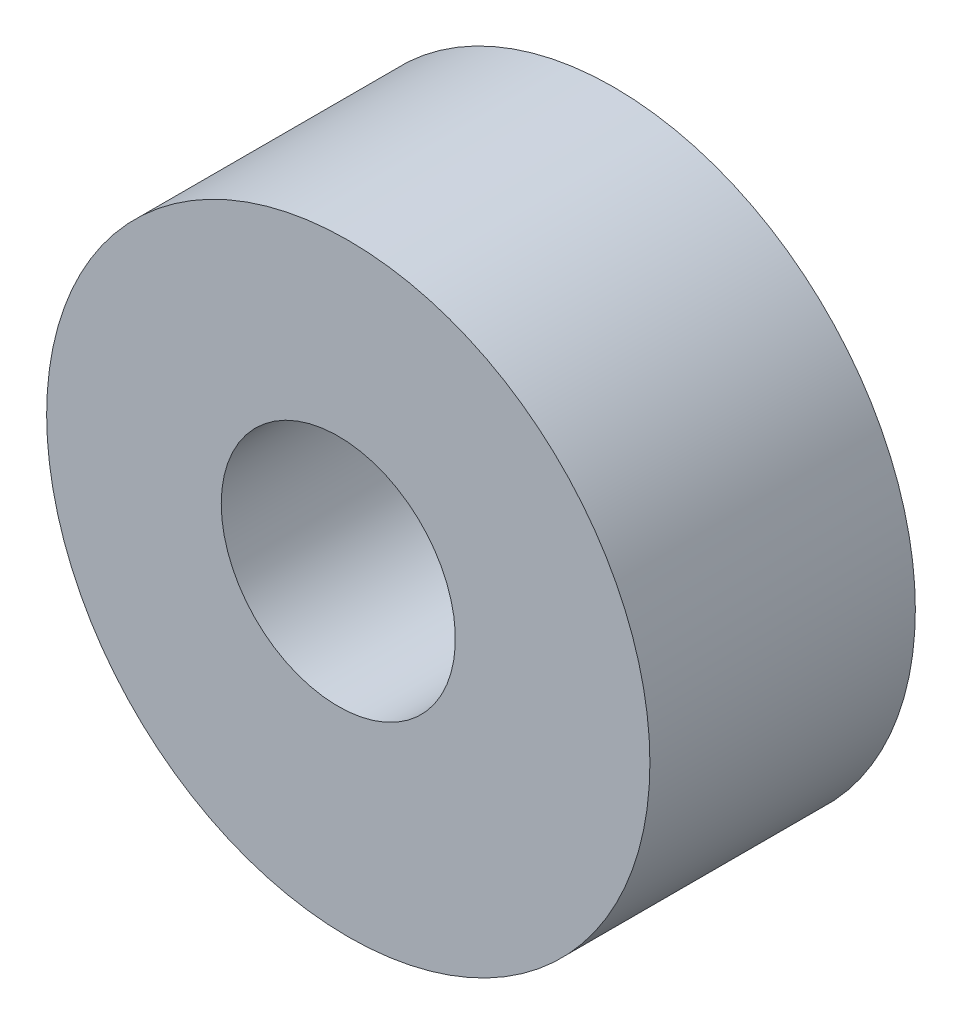
ISO-10303-21;
HEADER;
FILE_DESCRIPTION(('STEP AP214'),'2;1');
FILE_NAME('part.step','',(''),(''),'','','');
FILE_SCHEMA(('AUTOMOTIVE_DESIGN { 1 0 10303 214 1 1 1 1 }'));
ENDSEC;
DATA;
#1=APPLICATION_CONTEXT('core data for automotive mechanical design processes');
#2=APPLICATION_PROTOCOL_DEFINITION('international standard','automotive_design',2000,#1);
#3=PRODUCT_CONTEXT('',#1,'mechanical');
#4=PRODUCT('Part','Part','',(#3));
#5=PRODUCT_RELATED_PRODUCT_CATEGORY('part','',(#4));
#6=PRODUCT_DEFINITION_FORMATION('','',#4);
#7=PRODUCT_DEFINITION_CONTEXT('part definition',#1,'design');
#8=PRODUCT_DEFINITION('design','',#6,#7);
#9=PRODUCT_DEFINITION_SHAPE('','',#8);
#10=(LENGTH_UNIT() NAMED_UNIT(*) SI_UNIT(.MILLI.,.METRE.));
#11=(NAMED_UNIT(*) PLANE_ANGLE_UNIT() SI_UNIT($,.RADIAN.));
#12=(NAMED_UNIT(*) SI_UNIT($,.STERADIAN.) SOLID_ANGLE_UNIT());
#13=UNCERTAINTY_MEASURE_WITH_UNIT(LENGTH_MEASURE(1.E-05),#10,'distance_accuracy_value','');
#14=(GEOMETRIC_REPRESENTATION_CONTEXT(3) GLOBAL_UNCERTAINTY_ASSIGNED_CONTEXT((#13)) GLOBAL_UNIT_ASSIGNED_CONTEXT((#10,
#11,#12)) REPRESENTATION_CONTEXT('',''));
#15=CARTESIAN_POINT('',(0.,0.,0.));
#16=DIRECTION('',(0.,0.,1.));
#17=DIRECTION('',(1.,0.,0.));
#18=AXIS2_PLACEMENT_3D('',#15,#16,#17);
#19=CARTESIAN_POINT('',(0.,0.,5.588));
#20=DIRECTION('',(0.,0.,1.));
#21=DIRECTION('',(1.,0.,0.));
#22=AXIS2_PLACEMENT_3D('',#19,#20,#21);
#23=PLANE('',#22);
#24=CARTESIAN_POINT('',(0.,0.,5.588));
#25=DIRECTION('',(0.,0.,1.));
#26=DIRECTION('',(1.,0.,0.));
#27=AXIS2_PLACEMENT_3D('',#24,#25,#26);
#28=CIRCLE('',#27,6.35);
#29=CARTESIAN_POINT('',(6.35,0.,5.588));
#30=VERTEX_POINT('',#29);
#31=EDGE_CURVE('E10',#30,#30,#28,.T.);
#32=ORIENTED_EDGE('',*,*,#31,.T.);
#33=EDGE_LOOP('',(#32));
#34=FACE_BOUND('',#33,.T.);
#35=CARTESIAN_POINT('',(-0.210184999997926,0.210789276342698,5.588));
#36=DIRECTION('',(0.,0.,1.));
#37=DIRECTION('',(1.,0.,0.));
#38=AXIS2_PLACEMENT_3D('',#35,#36,#37);
#39=CIRCLE('',#38,2.464308);
#40=CARTESIAN_POINT('',(-2.67449299999793,0.210789276342697,5.588));
#41=VERTEX_POINT('',#40);
#42=EDGE_CURVE('E46',#41,#41,#39,.F.);
#43=ORIENTED_EDGE('',*,*,#42,.T.);
#44=EDGE_LOOP('',(#43));
#45=FACE_BOUND('',#44,.T.);
#46=ADVANCED_FACE('F33',(#34,#45),#23,.T.);
#47=CARTESIAN_POINT('',(0.,0.,0.));
#48=DIRECTION('',(0.,0.,1.));
#49=DIRECTION('',(1.,0.,0.));
#50=AXIS2_PLACEMENT_3D('',#47,#48,#49);
#51=PLANE('',#50);
#52=CARTESIAN_POINT('',(0.,0.,0.));
#53=DIRECTION('',(0.,0.,1.));
#54=DIRECTION('',(1.,0.,0.));
#55=AXIS2_PLACEMENT_3D('',#52,#53,#54);
#56=CIRCLE('',#55,6.35);
#57=CARTESIAN_POINT('',(6.35,0.,0.));
#58=VERTEX_POINT('',#57);
#59=EDGE_CURVE('E41',#58,#58,#56,.T.);
#60=ORIENTED_EDGE('',*,*,#59,.F.);
#61=EDGE_LOOP('',(#60));
#62=FACE_BOUND('',#61,.T.);
#63=CARTESIAN_POINT('',(-0.210184999997927,0.210789276342698,0.));
#64=DIRECTION('',(0.,0.,1.));
#65=DIRECTION('',(1.,0.,0.));
#66=AXIS2_PLACEMENT_3D('',#63,#64,#65);
#67=CIRCLE('',#66,2.464308);
#68=CARTESIAN_POINT('',(-2.67449299999793,0.210789276342697,0.));
#69=VERTEX_POINT('',#68);
#70=EDGE_CURVE('E37',#69,#69,#67,.F.);
#71=ORIENTED_EDGE('',*,*,#70,.F.);
#72=EDGE_LOOP('',(#71));
#73=FACE_BOUND('',#72,.T.);
#74=ADVANCED_FACE('F56',(#62,#73),#51,.F.);
#75=CARTESIAN_POINT('',(0.,0.,5.588));
#76=DIRECTION('',(0.,0.,-1.));
#77=DIRECTION('',(-1.,0.,0.));
#78=AXIS2_PLACEMENT_3D('',#75,#76,#77);
#79=CYLINDRICAL_SURFACE('',#78,6.35);
#80=ORIENTED_EDGE('',*,*,#31,.F.);
#81=EDGE_LOOP('',(#80));
#82=FACE_BOUND('',#81,.T.);
#83=ORIENTED_EDGE('',*,*,#59,.T.);
#84=EDGE_LOOP('',(#83));
#85=FACE_BOUND('',#84,.T.);
#86=ADVANCED_FACE('F35',(#82,#85),#79,.T.);
#87=CARTESIAN_POINT('',(-0.210184999997927,0.210789276342698,-5.12495799999998));
#88=DIRECTION('',(0.,0.,1.));
#89=DIRECTION('',(-1.,0.,0.));
#90=AXIS2_PLACEMENT_3D('',#87,#88,#89);
#91=CYLINDRICAL_SURFACE('',#90,2.464308);
#92=CARTESIAN_POINT('',(-2.67449299999793,0.210789276342697,5.588));
#93=CARTESIAN_POINT('',(-2.67449299999793,0.210789276342697,5.52979166666667));
#94=CARTESIAN_POINT('',(-2.67449299999793,0.210789276342697,5.47158333333333));
#95=CARTESIAN_POINT('',(-2.67449299999793,0.210789276342697,5.35516666666667));
#96=CARTESIAN_POINT('',(-2.67449299999793,0.210789276342697,5.29695833333333));
#97=CARTESIAN_POINT('',(-2.67449299999793,0.210789276342697,5.18054166666667));
#98=CARTESIAN_POINT('',(-2.67449299999793,0.210789276342697,5.12233333333333));
#99=CARTESIAN_POINT('',(-2.67449299999793,0.210789276342697,5.00591666666667));
#100=CARTESIAN_POINT('',(-2.67449299999793,0.210789276342697,4.94770833333333));
#101=CARTESIAN_POINT('',(-2.67449299999793,0.210789276342697,4.83129166666667));
#102=CARTESIAN_POINT('',(-2.67449299999793,0.210789276342697,4.77308333333333));
#103=CARTESIAN_POINT('',(-2.67449299999793,0.210789276342697,4.65666666666667));
#104=CARTESIAN_POINT('',(-2.67449299999793,0.210789276342697,4.59845833333333));
#105=CARTESIAN_POINT('',(-2.67449299999793,0.210789276342697,4.48204166666667));
#106=CARTESIAN_POINT('',(-2.67449299999793,0.210789276342697,4.42383333333333));
#107=CARTESIAN_POINT('',(-2.67449299999793,0.210789276342697,4.30741666666667));
#108=CARTESIAN_POINT('',(-2.67449299999793,0.210789276342697,4.24920833333333));
#109=CARTESIAN_POINT('',(-2.67449299999793,0.210789276342697,4.13279166666667));
#110=CARTESIAN_POINT('',(-2.67449299999793,0.210789276342697,4.07458333333333));
#111=CARTESIAN_POINT('',(-2.67449299999793,0.210789276342697,3.95816666666667));
#112=CARTESIAN_POINT('',(-2.67449299999793,0.210789276342697,3.89995833333333));
#113=CARTESIAN_POINT('',(-2.67449299999793,0.210789276342697,3.78354166666667));
#114=CARTESIAN_POINT('',(-2.67449299999793,0.210789276342697,3.72533333333333));
#115=CARTESIAN_POINT('',(-2.67449299999793,0.210789276342697,3.60891666666667));
#116=CARTESIAN_POINT('',(-2.67449299999793,0.210789276342697,3.55070833333333));
#117=CARTESIAN_POINT('',(-2.67449299999793,0.210789276342697,3.43429166666667));
#118=CARTESIAN_POINT('',(-2.67449299999793,0.210789276342697,3.37608333333333));
#119=CARTESIAN_POINT('',(-2.67449299999793,0.210789276342697,3.25966666666667));
#120=CARTESIAN_POINT('',(-2.67449299999793,0.210789276342697,3.20145833333333));
#121=CARTESIAN_POINT('',(-2.67449299999793,0.210789276342697,3.08504166666667));
#122=CARTESIAN_POINT('',(-2.67449299999793,0.210789276342697,3.02683333333333));
#123=CARTESIAN_POINT('',(-2.67449299999793,0.210789276342697,2.91041666666667));
#124=CARTESIAN_POINT('',(-2.67449299999793,0.210789276342697,2.85220833333333));
#125=CARTESIAN_POINT('',(-2.67449299999793,0.210789276342697,2.73579166666667));
#126=CARTESIAN_POINT('',(-2.67449299999793,0.210789276342697,2.67758333333333));
#127=CARTESIAN_POINT('',(-2.67449299999793,0.210789276342697,2.56116666666667));
#128=CARTESIAN_POINT('',(-2.67449299999793,0.210789276342697,2.50295833333333));
#129=CARTESIAN_POINT('',(-2.67449299999793,0.210789276342697,2.38654166666667));
#130=CARTESIAN_POINT('',(-2.67449299999793,0.210789276342697,2.32833333333333));
#131=CARTESIAN_POINT('',(-2.67449299999793,0.210789276342697,2.21191666666667));
#132=CARTESIAN_POINT('',(-2.67449299999793,0.210789276342697,2.15370833333333));
#133=CARTESIAN_POINT('',(-2.67449299999793,0.210789276342697,2.03729166666667));
#134=CARTESIAN_POINT('',(-2.67449299999793,0.210789276342697,1.97908333333333));
#135=CARTESIAN_POINT('',(-2.67449299999793,0.210789276342697,1.86266666666667));
#136=CARTESIAN_POINT('',(-2.67449299999793,0.210789276342697,1.80445833333333));
#137=CARTESIAN_POINT('',(-2.67449299999793,0.210789276342697,1.68804166666667));
#138=CARTESIAN_POINT('',(-2.67449299999793,0.210789276342697,1.62983333333333));
#139=CARTESIAN_POINT('',(-2.67449299999793,0.210789276342697,1.51341666666667));
#140=CARTESIAN_POINT('',(-2.67449299999793,0.210789276342697,1.45520833333333));
#141=CARTESIAN_POINT('',(-2.67449299999793,0.210789276342697,1.33879166666667));
#142=CARTESIAN_POINT('',(-2.67449299999793,0.210789276342697,1.28058333333333));
#143=CARTESIAN_POINT('',(-2.67449299999793,0.210789276342697,1.16416666666667));
#144=CARTESIAN_POINT('',(-2.67449299999793,0.210789276342697,1.10595833333333));
#145=CARTESIAN_POINT('',(-2.67449299999793,0.210789276342697,0.989541666666667));
#146=CARTESIAN_POINT('',(-2.67449299999793,0.210789276342697,0.931333333333333));
#147=CARTESIAN_POINT('',(-2.67449299999793,0.210789276342697,0.814916666666667));
#148=CARTESIAN_POINT('',(-2.67449299999793,0.210789276342697,0.756708333333334));
#149=CARTESIAN_POINT('',(-2.67449299999793,0.210789276342697,0.640291666666667));
#150=CARTESIAN_POINT('',(-2.67449299999793,0.210789276342697,0.582083333333333));
#151=CARTESIAN_POINT('',(-2.67449299999793,0.210789276342697,0.465666666666667));
#152=CARTESIAN_POINT('',(-2.67449299999793,0.210789276342697,0.407458333333333));
#153=CARTESIAN_POINT('',(-2.67449299999793,0.210789276342697,0.291041666666667));
#154=CARTESIAN_POINT('',(-2.67449299999793,0.210789276342697,0.232833333333333));
#155=CARTESIAN_POINT('',(-2.67449299999793,0.210789276342697,0.116416666666667));
#156=CARTESIAN_POINT('',(-2.67449299999793,0.210789276342697,0.0582083333333335));
#157=CARTESIAN_POINT('',(-2.67449299999793,0.210789276342697,0.));
#158=B_SPLINE_CURVE_WITH_KNOTS('',3,(#92,#93,#94,#95,#96,#97,#98,#99,#100,#101,#102,#103,#104,
#105,#106,#107,#108,#109,#110,#111,#112,#113,#114,#115,#116,#117,#118,#119,#120,#121,#122,#123,
#124,#125,#126,#127,#128,#129,#130,#131,#132,#133,#134,#135,#136,#137,#138,#139,#140,#141,#142,
#143,#144,#145,#146,#147,#148,#149,#150,#151,#152,#153,#154,#155,#156,#157),.UNSPECIFIED.,.F.,
.F.,(4,2,2,2,2,2,2,2,2,2,2,2,2,2,2,2,2,2,2,2,2,2,2,2,2,2,2,2,2,2,2,2,4),(0.,0.174624999999999,
0.349250000000001,0.523875,0.698499999999999,0.873125000000001,1.04775,1.222375,1.397,1.571625,
1.74625,1.920875,2.0955,2.270125,2.44475,2.619375,2.794,2.968625,3.14325,3.317875,3.4925,
3.667125,3.84175,4.016375,4.191,4.365625,4.54025,4.714875,4.8895,5.064125,5.23875,5.413375,
5.588),.UNSPECIFIED.);
#159=EDGE_CURVE('BSEAM54',#41,#69,#158,.T.);
#160=ORIENTED_EDGE('',*,*,#42,.F.);
#161=ORIENTED_EDGE('',*,*,#70,.T.);
#162=ORIENTED_EDGE('',*,*,#159,.T.);
#163=ORIENTED_EDGE('',*,*,#159,.F.);
#164=EDGE_LOOP('',(#160,#162,#161,#163));
#165=FACE_BOUND('',#164,.T.);
#166=ADVANCED_FACE('F54',(#165),#91,.F.);
#167=CLOSED_SHELL('',(#46,#74,#86,#166));
#168=MANIFOLD_SOLID_BREP('B2',#167);
#169=ADVANCED_BREP_SHAPE_REPRESENTATION('',(#18,#168),#14);
#170=SHAPE_DEFINITION_REPRESENTATION(#9,#169);
ENDSEC;
END-ISO-10303-21;
